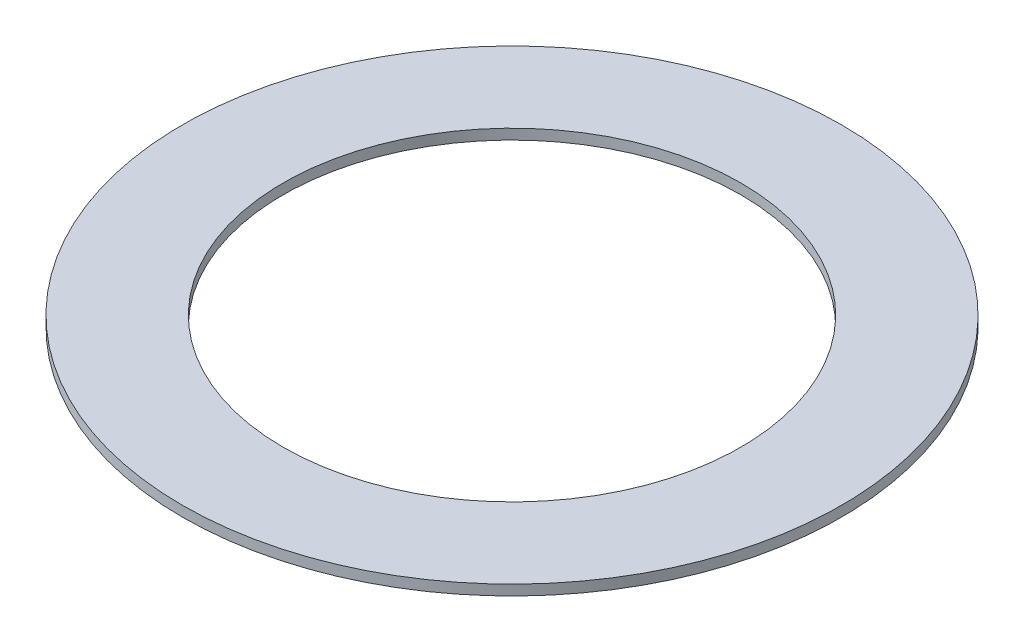
ISO-10303-21;
HEADER;
FILE_DESCRIPTION(('STEP AP214'),'2;1');
FILE_NAME('part.step','',(''),(''),'','','');
FILE_SCHEMA(('AUTOMOTIVE_DESIGN { 1 0 10303 214 1 1 1 1 }'));
ENDSEC;
DATA;
#1=APPLICATION_CONTEXT('core data for automotive mechanical design processes');
#2=APPLICATION_PROTOCOL_DEFINITION('international standard','automotive_design',2000,#1);
#3=PRODUCT_CONTEXT('',#1,'mechanical');
#4=PRODUCT('Part','Part','',(#3));
#5=PRODUCT_RELATED_PRODUCT_CATEGORY('part','',(#4));
#6=PRODUCT_DEFINITION_FORMATION('','',#4);
#7=PRODUCT_DEFINITION_CONTEXT('part definition',#1,'design');
#8=PRODUCT_DEFINITION('design','',#6,#7);
#9=PRODUCT_DEFINITION_SHAPE('','',#8);
#10=(LENGTH_UNIT() NAMED_UNIT(*) SI_UNIT(.MILLI.,.METRE.));
#11=(NAMED_UNIT(*) PLANE_ANGLE_UNIT() SI_UNIT($,.RADIAN.));
#12=(NAMED_UNIT(*) SI_UNIT($,.STERADIAN.) SOLID_ANGLE_UNIT());
#13=UNCERTAINTY_MEASURE_WITH_UNIT(LENGTH_MEASURE(1.E-05),#10,'distance_accuracy_value','');
#14=(GEOMETRIC_REPRESENTATION_CONTEXT(3) GLOBAL_UNCERTAINTY_ASSIGNED_CONTEXT((#13)) GLOBAL_UNIT_ASSIGNED_CONTEXT((#10,
#11,#12)) REPRESENTATION_CONTEXT('',''));
#15=CARTESIAN_POINT('',(0.,0.,0.));
#16=DIRECTION('',(0.,0.,1.));
#17=DIRECTION('',(1.,0.,0.));
#18=AXIS2_PLACEMENT_3D('',#15,#16,#17);
#19=CARTESIAN_POINT('',(0.,0.25,0.));
#20=DIRECTION('',(0.,1.,0.));
#21=DIRECTION('',(0.,0.,1.));
#22=AXIS2_PLACEMENT_3D('',#19,#20,#21);
#23=PLANE('',#22);
#24=CARTESIAN_POINT('',(0.,0.25,0.));
#25=DIRECTION('',(0.,1.,0.));
#26=DIRECTION('',(0.,0.,1.));
#27=AXIS2_PLACEMENT_3D('',#24,#25,#26);
#28=CIRCLE('',#27,8.);
#29=CARTESIAN_POINT('',(0.,0.25,8.));
#30=VERTEX_POINT('',#29);
#31=EDGE_CURVE('E10',#30,#30,#28,.T.);
#32=ORIENTED_EDGE('',*,*,#31,.T.);
#33=EDGE_LOOP('',(#32));
#34=FACE_BOUND('',#33,.T.);
#35=CARTESIAN_POINT('',(0.,0.25,0.));
#36=DIRECTION('',(0.,1.,0.));
#37=DIRECTION('',(0.,0.,1.));
#38=AXIS2_PLACEMENT_3D('',#35,#36,#37);
#39=CIRCLE('',#38,5.55625);
#40=CARTESIAN_POINT('',(0.,0.25,5.55625));
#41=VERTEX_POINT('',#40);
#42=EDGE_CURVE('E41',#41,#41,#39,.T.);
#43=ORIENTED_EDGE('',*,*,#42,.F.);
#44=EDGE_LOOP('',(#43));
#45=FACE_BOUND('',#44,.T.);
#46=ADVANCED_FACE('F30',(#34,#45),#23,.T.);
#47=CARTESIAN_POINT('',(0.,0.,0.));
#48=DIRECTION('',(0.,1.,0.));
#49=DIRECTION('',(0.,0.,1.));
#50=AXIS2_PLACEMENT_3D('',#47,#48,#49);
#51=PLANE('',#50);
#52=CARTESIAN_POINT('',(0.,0.,0.));
#53=DIRECTION('',(0.,1.,0.));
#54=DIRECTION('',(0.,0.,1.));
#55=AXIS2_PLACEMENT_3D('',#52,#53,#54);
#56=CIRCLE('',#55,8.);
#57=CARTESIAN_POINT('',(0.,0.,8.));
#58=VERTEX_POINT('',#57);
#59=EDGE_CURVE('E34',#58,#58,#56,.T.);
#60=ORIENTED_EDGE('',*,*,#59,.F.);
#61=EDGE_LOOP('',(#60));
#62=FACE_BOUND('',#61,.T.);
#63=CARTESIAN_POINT('',(0.,0.,0.));
#64=DIRECTION('',(0.,1.,0.));
#65=DIRECTION('',(0.,0.,1.));
#66=AXIS2_PLACEMENT_3D('',#63,#64,#65);
#67=CIRCLE('',#66,5.55625);
#68=CARTESIAN_POINT('',(0.,0.,5.55625));
#69=VERTEX_POINT('',#68);
#70=EDGE_CURVE('E43',#69,#69,#67,.T.);
#71=ORIENTED_EDGE('',*,*,#70,.T.);
#72=EDGE_LOOP('',(#71));
#73=FACE_BOUND('',#72,.T.);
#74=ADVANCED_FACE('F53',(#62,#73),#51,.F.);
#75=CARTESIAN_POINT('',(0.,0.25,0.));
#76=DIRECTION('',(0.,-1.,0.));
#77=DIRECTION('',(0.,0.,-1.));
#78=AXIS2_PLACEMENT_3D('',#75,#76,#77);
#79=CYLINDRICAL_SURFACE('',#78,8.);
#80=ORIENTED_EDGE('',*,*,#31,.F.);
#81=EDGE_LOOP('',(#80));
#82=FACE_BOUND('',#81,.T.);
#83=ORIENTED_EDGE('',*,*,#59,.T.);
#84=EDGE_LOOP('',(#83));
#85=FACE_BOUND('',#84,.T.);
#86=ADVANCED_FACE('F32',(#82,#85),#79,.T.);
#87=CARTESIAN_POINT('',(0.,0.25,0.));
#88=DIRECTION('',(0.,-1.,0.));
#89=DIRECTION('',(0.,0.,-1.));
#90=AXIS2_PLACEMENT_3D('',#87,#88,#89);
#91=CYLINDRICAL_SURFACE('',#90,5.55625);
#92=ORIENTED_EDGE('',*,*,#42,.T.);
#93=EDGE_LOOP('',(#92));
#94=FACE_BOUND('',#93,.T.);
#95=ORIENTED_EDGE('',*,*,#70,.F.);
#96=EDGE_LOOP('',(#95));
#97=FACE_BOUND('',#96,.T.);
#98=ADVANCED_FACE('F49',(#94,#97),#91,.F.);
#99=CLOSED_SHELL('',(#46,#74,#86,#98));
#100=MANIFOLD_SOLID_BREP('B2',#99);
#101=ADVANCED_BREP_SHAPE_REPRESENTATION('',(#18,#100),#14);
#102=SHAPE_DEFINITION_REPRESENTATION(#9,#101);
ENDSEC;
END-ISO-10303-21;
